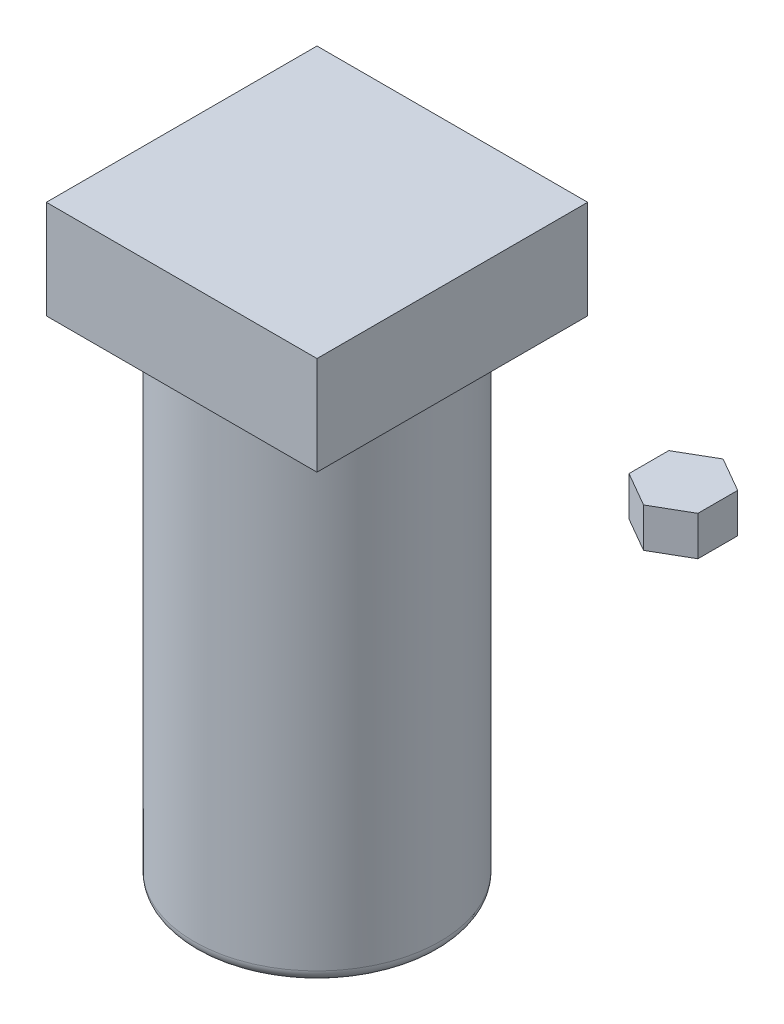
ISO-10303-21;
HEADER;
FILE_DESCRIPTION(('STEP AP214'),'2;1');
FILE_NAME('part.step','',(''),(''),'','','');
FILE_SCHEMA(('AUTOMOTIVE_DESIGN { 1 0 10303 214 1 1 1 1 }'));
ENDSEC;
DATA;
#1=APPLICATION_CONTEXT('core data for automotive mechanical design processes');
#2=APPLICATION_PROTOCOL_DEFINITION('international standard','automotive_design',2000,#1);
#3=PRODUCT_CONTEXT('',#1,'mechanical');
#4=PRODUCT('Part','Part','',(#3));
#5=PRODUCT_RELATED_PRODUCT_CATEGORY('part','',(#4));
#6=PRODUCT_DEFINITION_FORMATION('','',#4);
#7=PRODUCT_DEFINITION_CONTEXT('part definition',#1,'design');
#8=PRODUCT_DEFINITION('design','',#6,#7);
#9=PRODUCT_DEFINITION_SHAPE('','',#8);
#10=(LENGTH_UNIT() NAMED_UNIT(*) SI_UNIT(.MILLI.,.METRE.));
#11=(NAMED_UNIT(*) PLANE_ANGLE_UNIT() SI_UNIT($,.RADIAN.));
#12=(NAMED_UNIT(*) SI_UNIT($,.STERADIAN.) SOLID_ANGLE_UNIT());
#13=UNCERTAINTY_MEASURE_WITH_UNIT(LENGTH_MEASURE(1.E-05),#10,'distance_accuracy_value','');
#14=(GEOMETRIC_REPRESENTATION_CONTEXT(3) GLOBAL_UNCERTAINTY_ASSIGNED_CONTEXT((#13)) GLOBAL_UNIT_ASSIGNED_CONTEXT((#10,
#11,#12)) REPRESENTATION_CONTEXT('',''));
#15=CARTESIAN_POINT('',(0.,0.,0.));
#16=DIRECTION('',(0.,0.,1.));
#17=DIRECTION('',(1.,0.,0.));
#18=AXIS2_PLACEMENT_3D('',#15,#16,#17);
#19=CARTESIAN_POINT('',(42.8260773427026,5.08,2.56632194654789));
#20=DIRECTION('',(0.499999999999999,0.,-0.866025403784439));
#21=DIRECTION('',(-0.866025403784439,0.,-0.499999999999999));
#22=AXIS2_PLACEMENT_3D('',#19,#20,#21);
#23=PLANE('',#22);
#24=DIRECTION('',(0.866025403784439,0.,0.499999999999999));
#25=VECTOR('',#24,1.);
#26=CARTESIAN_POINT('',(42.8260773427026,0.,2.56632194654789));
#27=LINE('',#26,#25);
#28=CARTESIAN_POINT('',(42.8260773427026,0.,2.56632194654789));
#29=VERTEX_POINT('',#28);
#30=CARTESIAN_POINT('',(47.2710773427026,0.,5.13264389309577));
#31=VERTEX_POINT('',#30);
#32=EDGE_CURVE('E131',#29,#31,#27,.T.);
#33=ORIENTED_EDGE('',*,*,#32,.T.);
#34=DIRECTION('',(0.,-1.,0.));
#35=VECTOR('',#34,1.);
#36=CARTESIAN_POINT('',(47.2710773427026,5.08,5.13264389309577));
#37=LINE('',#36,#35);
#38=CARTESIAN_POINT('',(47.2710773427026,5.08,5.13264389309577));
#39=VERTEX_POINT('',#38);
#40=EDGE_CURVE('E12',#39,#31,#37,.T.);
#41=ORIENTED_EDGE('',*,*,#40,.F.);
#42=DIRECTION('',(0.866025403784439,0.,0.499999999999999));
#43=VECTOR('',#42,1.);
#44=CARTESIAN_POINT('',(42.8260773427026,5.08,2.56632194654789));
#45=LINE('',#44,#43);
#46=CARTESIAN_POINT('',(42.8260773427026,5.08,2.56632194654789));
#47=VERTEX_POINT('',#46);
#48=EDGE_CURVE('E141',#47,#39,#45,.T.);
#49=ORIENTED_EDGE('',*,*,#48,.F.);
#50=DIRECTION('',(0.,-1.,0.));
#51=VECTOR('',#50,1.);
#52=CARTESIAN_POINT('',(42.8260773427026,5.08,2.56632194654789));
#53=LINE('',#52,#51);
#54=EDGE_CURVE('E127',#47,#29,#53,.T.);
#55=ORIENTED_EDGE('',*,*,#54,.T.);
#56=EDGE_LOOP('',(#33,#41,#49,#55));
#57=FACE_BOUND('',#56,.T.);
#58=ADVANCED_FACE('F47',(#57),#23,.F.);
#59=CARTESIAN_POINT('',(47.2710773427026,5.08,5.13264389309577));
#60=DIRECTION('',(-0.500000000000001,0.,-0.866025403784438));
#61=DIRECTION('',(-0.866025403784438,0.,0.500000000000001));
#62=AXIS2_PLACEMENT_3D('',#59,#60,#61);
#63=PLANE('',#62);
#64=DIRECTION('',(0.866025403784438,0.,-0.500000000000001));
#65=VECTOR('',#64,1.);
#66=CARTESIAN_POINT('',(47.2710773427026,0.,5.13264389309577));
#67=LINE('',#66,#65);
#68=CARTESIAN_POINT('',(51.7160773427026,0.,2.56632194654789));
#69=VERTEX_POINT('',#68);
#70=EDGE_CURVE('E134',#31,#69,#67,.T.);
#71=ORIENTED_EDGE('',*,*,#70,.T.);
#72=DIRECTION('',(0.,-1.,0.));
#73=VECTOR('',#72,1.);
#74=CARTESIAN_POINT('',(51.7160773427026,5.08,2.56632194654789));
#75=LINE('',#74,#73);
#76=CARTESIAN_POINT('',(51.7160773427026,5.08,2.56632194654789));
#77=VERTEX_POINT('',#76);
#78=EDGE_CURVE('E55',#77,#69,#75,.T.);
#79=ORIENTED_EDGE('',*,*,#78,.F.);
#80=DIRECTION('',(0.866025403784438,0.,-0.500000000000001));
#81=VECTOR('',#80,1.);
#82=CARTESIAN_POINT('',(47.2710773427026,5.08,5.13264389309577));
#83=LINE('',#82,#81);
#84=EDGE_CURVE('E100',#39,#77,#83,.T.);
#85=ORIENTED_EDGE('',*,*,#84,.F.);
#86=ORIENTED_EDGE('',*,*,#40,.T.);
#87=EDGE_LOOP('',(#71,#79,#85,#86));
#88=FACE_BOUND('',#87,.T.);
#89=ADVANCED_FACE('F165',(#88),#63,.F.);
#90=CARTESIAN_POINT('',(51.7160773427026,5.08,2.56632194654789));
#91=DIRECTION('',(-1.,0.,0.));
#92=DIRECTION('',(0.,0.,1.));
#93=AXIS2_PLACEMENT_3D('',#90,#91,#92);
#94=PLANE('',#93);
#95=DIRECTION('',(0.,0.,-1.));
#96=VECTOR('',#95,1.);
#97=CARTESIAN_POINT('',(51.7160773427026,0.,2.56632194654789));
#98=LINE('',#97,#96);
#99=CARTESIAN_POINT('',(51.7160773427026,0.,-2.56632194654789));
#100=VERTEX_POINT('',#99);
#101=EDGE_CURVE('E136',#69,#100,#98,.T.);
#102=ORIENTED_EDGE('',*,*,#101,.T.);
#103=DIRECTION('',(0.,-1.,0.));
#104=VECTOR('',#103,1.);
#105=CARTESIAN_POINT('',(51.7160773427026,5.08,-2.56632194654789));
#106=LINE('',#105,#104);
#107=CARTESIAN_POINT('',(51.7160773427026,5.08,-2.56632194654789));
#108=VERTEX_POINT('',#107);
#109=EDGE_CURVE('E122',#108,#100,#106,.T.);
#110=ORIENTED_EDGE('',*,*,#109,.F.);
#111=DIRECTION('',(0.,0.,-1.));
#112=VECTOR('',#111,1.);
#113=CARTESIAN_POINT('',(51.7160773427026,5.08,2.56632194654789));
#114=LINE('',#113,#112);
#115=EDGE_CURVE('E113',#77,#108,#114,.T.);
#116=ORIENTED_EDGE('',*,*,#115,.F.);
#117=ORIENTED_EDGE('',*,*,#78,.T.);
#118=EDGE_LOOP('',(#102,#110,#116,#117));
#119=FACE_BOUND('',#118,.T.);
#120=ADVANCED_FACE('F147',(#119),#94,.F.);
#121=CARTESIAN_POINT('',(51.7160773427026,5.08,-2.56632194654789));
#122=DIRECTION('',(-0.5,0.,0.866025403784439));
#123=DIRECTION('',(0.866025403784439,0.,0.5));
#124=AXIS2_PLACEMENT_3D('',#121,#122,#123);
#125=PLANE('',#124);
#126=DIRECTION('',(-0.866025403784439,0.,-0.5));
#127=VECTOR('',#126,1.);
#128=CARTESIAN_POINT('',(51.7160773427026,0.,-2.56632194654789));
#129=LINE('',#128,#127);
#130=CARTESIAN_POINT('',(47.2710773427026,0.,-5.13264389309578));
#131=VERTEX_POINT('',#130);
#132=EDGE_CURVE('E121',#100,#131,#129,.T.);
#133=ORIENTED_EDGE('',*,*,#132,.T.);
#134=DIRECTION('',(0.,-1.,0.));
#135=VECTOR('',#134,1.);
#136=CARTESIAN_POINT('',(47.2710773427026,5.08,-5.13264389309578));
#137=LINE('',#136,#135);
#138=CARTESIAN_POINT('',(47.2710773427026,5.08,-5.13264389309578));
#139=VERTEX_POINT('',#138);
#140=EDGE_CURVE('E118',#139,#131,#137,.T.);
#141=ORIENTED_EDGE('',*,*,#140,.F.);
#142=DIRECTION('',(-0.866025403784439,0.,-0.5));
#143=VECTOR('',#142,1.);
#144=CARTESIAN_POINT('',(51.7160773427026,5.08,-2.56632194654789));
#145=LINE('',#144,#143);
#146=EDGE_CURVE('E107',#108,#139,#145,.T.);
#147=ORIENTED_EDGE('',*,*,#146,.F.);
#148=ORIENTED_EDGE('',*,*,#109,.T.);
#149=EDGE_LOOP('',(#133,#141,#147,#148));
#150=FACE_BOUND('',#149,.T.);
#151=ADVANCED_FACE('F119',(#150),#125,.F.);
#152=CARTESIAN_POINT('',(47.2710773427026,5.08,-5.13264389309578));
#153=DIRECTION('',(0.500000000000001,0.,0.866025403784438));
#154=DIRECTION('',(0.866025403784438,0.,-0.500000000000001));
#155=AXIS2_PLACEMENT_3D('',#152,#153,#154);
#156=PLANE('',#155);
#157=DIRECTION('',(-0.866025403784438,0.,0.500000000000001));
#158=VECTOR('',#157,1.);
#159=CARTESIAN_POINT('',(47.2710773427026,0.,-5.13264389309578));
#160=LINE('',#159,#158);
#161=CARTESIAN_POINT('',(42.8260773427026,0.,-2.56632194654789));
#162=VERTEX_POINT('',#161);
#163=EDGE_CURVE('E86',#131,#162,#160,.T.);
#164=ORIENTED_EDGE('',*,*,#163,.T.);
#165=DIRECTION('',(0.,-1.,0.));
#166=VECTOR('',#165,1.);
#167=CARTESIAN_POINT('',(42.8260773427026,5.08,-2.56632194654789));
#168=LINE('',#167,#166);
#169=CARTESIAN_POINT('',(42.8260773427026,5.08,-2.56632194654789));
#170=VERTEX_POINT('',#169);
#171=EDGE_CURVE('E123',#170,#162,#168,.T.);
#172=ORIENTED_EDGE('',*,*,#171,.F.);
#173=DIRECTION('',(-0.866025403784438,0.,0.500000000000001));
#174=VECTOR('',#173,1.);
#175=CARTESIAN_POINT('',(47.2710773427026,5.08,-5.13264389309578));
#176=LINE('',#175,#174);
#177=EDGE_CURVE('E111',#139,#170,#176,.T.);
#178=ORIENTED_EDGE('',*,*,#177,.F.);
#179=ORIENTED_EDGE('',*,*,#140,.T.);
#180=EDGE_LOOP('',(#164,#172,#178,#179));
#181=FACE_BOUND('',#180,.T.);
#182=ADVANCED_FACE('F125',(#181),#156,.F.);
#183=CARTESIAN_POINT('',(42.8260773427026,5.08,-2.56632194654789));
#184=DIRECTION('',(1.,0.,0.));
#185=DIRECTION('',(0.,0.,-1.));
#186=AXIS2_PLACEMENT_3D('',#183,#184,#185);
#187=PLANE('',#186);
#188=DIRECTION('',(0.,0.,1.));
#189=VECTOR('',#188,1.);
#190=CARTESIAN_POINT('',(42.8260773427026,0.,-2.56632194654789));
#191=LINE('',#190,#189);
#192=EDGE_CURVE('E92',#162,#29,#191,.T.);
#193=ORIENTED_EDGE('',*,*,#192,.T.);
#194=ORIENTED_EDGE('',*,*,#54,.F.);
#195=DIRECTION('',(0.,0.,1.));
#196=VECTOR('',#195,1.);
#197=CARTESIAN_POINT('',(42.8260773427026,5.08,-2.56632194654789));
#198=LINE('',#197,#196);
#199=EDGE_CURVE('E63',#170,#47,#198,.T.);
#200=ORIENTED_EDGE('',*,*,#199,.F.);
#201=ORIENTED_EDGE('',*,*,#171,.T.);
#202=EDGE_LOOP('',(#193,#194,#200,#201));
#203=FACE_BOUND('',#202,.T.);
#204=ADVANCED_FACE('F154',(#203),#187,.F.);
#205=CARTESIAN_POINT('',(0.,5.08,0.));
#206=DIRECTION('',(0.,1.,0.));
#207=DIRECTION('',(0.,0.,1.));
#208=AXIS2_PLACEMENT_3D('',#205,#206,#207);
#209=PLANE('',#208);
#210=ORIENTED_EDGE('',*,*,#48,.T.);
#211=ORIENTED_EDGE('',*,*,#84,.T.);
#212=ORIENTED_EDGE('',*,*,#115,.T.);
#213=ORIENTED_EDGE('',*,*,#146,.T.);
#214=ORIENTED_EDGE('',*,*,#177,.T.);
#215=ORIENTED_EDGE('',*,*,#199,.T.);
#216=EDGE_LOOP('',(#210,#211,#212,#213,#214,#215));
#217=FACE_BOUND('',#216,.T.);
#218=ADVANCED_FACE('F109',(#217),#209,.T.);
#219=CARTESIAN_POINT('',(0.,0.,0.));
#220=DIRECTION('',(0.,1.,0.));
#221=DIRECTION('',(0.,0.,1.));
#222=AXIS2_PLACEMENT_3D('',#219,#220,#221);
#223=PLANE('',#222);
#224=ORIENTED_EDGE('',*,*,#32,.F.);
#225=ORIENTED_EDGE('',*,*,#192,.F.);
#226=ORIENTED_EDGE('',*,*,#163,.F.);
#227=ORIENTED_EDGE('',*,*,#132,.F.);
#228=ORIENTED_EDGE('',*,*,#101,.F.);
#229=ORIENTED_EDGE('',*,*,#70,.F.);
#230=EDGE_LOOP('',(#224,#225,#226,#227,#228,#229));
#231=FACE_BOUND('',#230,.T.);
#232=ADVANCED_FACE('F150',(#231),#223,.F.);
#233=CLOSED_SHELL('',(#58,#89,#120,#151,#182,#204,#218,#232));
#234=MANIFOLD_SOLID_BREP('B2',#233);
#235=CARTESIAN_POINT('',(17.4625,12.7,-17.4625));
#236=DIRECTION('',(-1.,0.,0.));
#237=DIRECTION('',(0.,0.,1.));
#238=AXIS2_PLACEMENT_3D('',#235,#236,#237);
#239=PLANE('',#238);
#240=DIRECTION('',(0.,0.,-1.));
#241=VECTOR('',#240,1.);
#242=CARTESIAN_POINT('',(17.4625,0.,-17.4625));
#243=LINE('',#242,#241);
#244=CARTESIAN_POINT('',(17.4625,0.,17.4625));
#245=VERTEX_POINT('',#244);
#246=CARTESIAN_POINT('',(17.4625,0.,-17.4625));
#247=VERTEX_POINT('',#246);
#248=EDGE_CURVE('E307',#245,#247,#243,.T.);
#249=ORIENTED_EDGE('',*,*,#248,.T.);
#250=DIRECTION('',(0.,-1.,0.));
#251=VECTOR('',#250,1.);
#252=CARTESIAN_POINT('',(17.4625,12.7,-17.4625));
#253=LINE('',#252,#251);
#254=CARTESIAN_POINT('',(17.4625,12.7,-17.4625));
#255=VERTEX_POINT('',#254);
#256=EDGE_CURVE('E298',#255,#247,#253,.T.);
#257=ORIENTED_EDGE('',*,*,#256,.F.);
#258=DIRECTION('',(0.,0.,-1.));
#259=VECTOR('',#258,1.);
#260=CARTESIAN_POINT('',(17.4625,12.7,-17.4625));
#261=LINE('',#260,#259);
#262=CARTESIAN_POINT('',(17.4625,12.7,17.4625));
#263=VERTEX_POINT('',#262);
#264=EDGE_CURVE('E292',#263,#255,#261,.T.);
#265=ORIENTED_EDGE('',*,*,#264,.F.);
#266=DIRECTION('',(0.,-1.,0.));
#267=VECTOR('',#266,1.);
#268=CARTESIAN_POINT('',(17.4625,12.7,17.4625));
#269=LINE('',#268,#267);
#270=EDGE_CURVE('E303',#263,#245,#269,.T.);
#271=ORIENTED_EDGE('',*,*,#270,.T.);
#272=EDGE_LOOP('',(#249,#257,#265,#271));
#273=FACE_BOUND('',#272,.T.);
#274=ADVANCED_FACE('F239',(#273),#239,.F.);
#275=CARTESIAN_POINT('',(-17.4625,12.7,-17.4625));
#276=DIRECTION('',(0.,0.,1.));
#277=DIRECTION('',(1.,0.,0.));
#278=AXIS2_PLACEMENT_3D('',#275,#276,#277);
#279=PLANE('',#278);
#280=DIRECTION('',(-1.,0.,0.));
#281=VECTOR('',#280,1.);
#282=CARTESIAN_POINT('',(-17.4625,0.,-17.4625));
#283=LINE('',#282,#281);
#284=CARTESIAN_POINT('',(-17.4625,0.,-17.4625));
#285=VERTEX_POINT('',#284);
#286=EDGE_CURVE('E297',#247,#285,#283,.T.);
#287=ORIENTED_EDGE('',*,*,#286,.T.);
#288=DIRECTION('',(0.,-1.,0.));
#289=VECTOR('',#288,1.);
#290=CARTESIAN_POINT('',(-17.4625,12.7,-17.4625));
#291=LINE('',#290,#289);
#292=CARTESIAN_POINT('',(-17.4625,12.7,-17.4625));
#293=VERTEX_POINT('',#292);
#294=EDGE_CURVE('E295',#293,#285,#291,.T.);
#295=ORIENTED_EDGE('',*,*,#294,.F.);
#296=DIRECTION('',(-1.,0.,0.));
#297=VECTOR('',#296,1.);
#298=CARTESIAN_POINT('',(-17.4625,12.7,-17.4625));
#299=LINE('',#298,#297);
#300=EDGE_CURVE('E287',#255,#293,#299,.T.);
#301=ORIENTED_EDGE('',*,*,#300,.F.);
#302=ORIENTED_EDGE('',*,*,#256,.T.);
#303=EDGE_LOOP('',(#287,#295,#301,#302));
#304=FACE_BOUND('',#303,.T.);
#305=ADVANCED_FACE('F296',(#304),#279,.F.);
#306=CARTESIAN_POINT('',(-17.4625,12.7,-17.4625));
#307=DIRECTION('',(1.,0.,0.));
#308=DIRECTION('',(0.,0.,-1.));
#309=AXIS2_PLACEMENT_3D('',#306,#307,#308);
#310=PLANE('',#309);
#311=DIRECTION('',(0.,0.,1.));
#312=VECTOR('',#311,1.);
#313=CARTESIAN_POINT('',(-17.4625,0.,-17.4625));
#314=LINE('',#313,#312);
#315=CARTESIAN_POINT('',(-17.4625,0.,17.4625));
#316=VERTEX_POINT('',#315);
#317=EDGE_CURVE('E273',#285,#316,#314,.T.);
#318=ORIENTED_EDGE('',*,*,#317,.T.);
#319=DIRECTION('',(0.,-1.,0.));
#320=VECTOR('',#319,1.);
#321=CARTESIAN_POINT('',(-17.4625,12.7,17.4625));
#322=LINE('',#321,#320);
#323=CARTESIAN_POINT('',(-17.4625,12.7,17.4625));
#324=VERTEX_POINT('',#323);
#325=EDGE_CURVE('E299',#324,#316,#322,.T.);
#326=ORIENTED_EDGE('',*,*,#325,.F.);
#327=DIRECTION('',(0.,0.,1.));
#328=VECTOR('',#327,1.);
#329=CARTESIAN_POINT('',(-17.4625,12.7,-17.4625));
#330=LINE('',#329,#328);
#331=EDGE_CURVE('E290',#293,#324,#330,.T.);
#332=ORIENTED_EDGE('',*,*,#331,.F.);
#333=ORIENTED_EDGE('',*,*,#294,.T.);
#334=EDGE_LOOP('',(#318,#326,#332,#333));
#335=FACE_BOUND('',#334,.T.);
#336=ADVANCED_FACE('F301',(#335),#310,.F.);
#337=CARTESIAN_POINT('',(-17.4625,12.7,17.4625));
#338=DIRECTION('',(0.,0.,-1.));
#339=DIRECTION('',(-1.,0.,0.));
#340=AXIS2_PLACEMENT_3D('',#337,#338,#339);
#341=PLANE('',#340);
#342=DIRECTION('',(1.,0.,0.));
#343=VECTOR('',#342,1.);
#344=CARTESIAN_POINT('',(-17.4625,0.,17.4625));
#345=LINE('',#344,#343);
#346=EDGE_CURVE('E279',#316,#245,#345,.T.);
#347=ORIENTED_EDGE('',*,*,#346,.T.);
#348=ORIENTED_EDGE('',*,*,#270,.F.);
#349=DIRECTION('',(1.,0.,0.));
#350=VECTOR('',#349,1.);
#351=CARTESIAN_POINT('',(-17.4625,12.7,17.4625));
#352=LINE('',#351,#350);
#353=EDGE_CURVE('E256',#324,#263,#352,.T.);
#354=ORIENTED_EDGE('',*,*,#353,.F.);
#355=ORIENTED_EDGE('',*,*,#325,.T.);
#356=EDGE_LOOP('',(#347,#348,#354,#355));
#357=FACE_BOUND('',#356,.T.);
#358=ADVANCED_FACE('F345',(#357),#341,.F.);
#359=CARTESIAN_POINT('',(0.,12.7,0.));
#360=DIRECTION('',(0.,1.,0.));
#361=DIRECTION('',(0.,0.,1.));
#362=AXIS2_PLACEMENT_3D('',#359,#360,#361);
#363=PLANE('',#362);
#364=ORIENTED_EDGE('',*,*,#264,.T.);
#365=ORIENTED_EDGE('',*,*,#300,.T.);
#366=ORIENTED_EDGE('',*,*,#331,.T.);
#367=ORIENTED_EDGE('',*,*,#353,.T.);
#368=EDGE_LOOP('',(#364,#365,#366,#367));
#369=FACE_BOUND('',#368,.T.);
#370=ADVANCED_FACE('F288',(#369),#363,.T.);
#371=CARTESIAN_POINT('',(0.,0.,0.));
#372=DIRECTION('',(0.,1.,0.));
#373=DIRECTION('',(0.,0.,1.));
#374=AXIS2_PLACEMENT_3D('',#371,#372,#373);
#375=PLANE('',#374);
#376=CARTESIAN_POINT('',(0.,0.,0.));
#377=DIRECTION('',(0.,1.,0.));
#378=DIRECTION('',(0.,0.,1.));
#379=AXIS2_PLACEMENT_3D('',#376,#377,#378);
#380=CIRCLE('',#379,15.875);
#381=CARTESIAN_POINT('',(0.,0.,15.875));
#382=VERTEX_POINT('',#381);
#383=EDGE_CURVE('E317',#382,#382,#380,.F.);
#384=ORIENTED_EDGE('',*,*,#383,.F.);
#385=EDGE_LOOP('',(#384));
#386=FACE_BOUND('',#385,.T.);
#387=ORIENTED_EDGE('',*,*,#248,.F.);
#388=ORIENTED_EDGE('',*,*,#346,.F.);
#389=ORIENTED_EDGE('',*,*,#317,.F.);
#390=ORIENTED_EDGE('',*,*,#286,.F.);
#391=EDGE_LOOP('',(#387,#388,#389,#390));
#392=FACE_BOUND('',#391,.T.);
#393=ADVANCED_FACE('F334',(#386,#392),#375,.F.);
#394=CARTESIAN_POINT('',(0.,-63.5,0.));
#395=DIRECTION('',(0.,-1.,0.));
#396=DIRECTION('',(0.,0.,-1.));
#397=AXIS2_PLACEMENT_3D('',#394,#395,#396);
#398=PLANE('',#397);
#399=CARTESIAN_POINT('',(0.,-63.5,0.));
#400=DIRECTION('',(0.,-1.,0.));
#401=DIRECTION('',(0.,0.,-1.));
#402=AXIS2_PLACEMENT_3D('',#399,#400,#401);
#403=CIRCLE('',#402,14.351);
#404=CARTESIAN_POINT('',(0.,-63.5,-14.351));
#405=VERTEX_POINT('',#404);
#406=EDGE_CURVE('E248',#405,#405,#403,.T.);
#407=ORIENTED_EDGE('',*,*,#406,.T.);
#408=EDGE_LOOP('',(#407));
#409=FACE_BOUND('',#408,.T.);
#410=CARTESIAN_POINT('',(0.,-63.5,0.));
#411=DIRECTION('',(0.,-1.,0.));
#412=DIRECTION('',(0.,0.,-1.));
#413=AXIS2_PLACEMENT_3D('',#410,#411,#412);
#414=CIRCLE('',#413,12.7);
#415=CARTESIAN_POINT('',(0.,-63.5,-12.7));
#416=VERTEX_POINT('',#415);
#417=EDGE_CURVE('E310',#416,#416,#414,.T.);
#418=ORIENTED_EDGE('',*,*,#417,.F.);
#419=EDGE_LOOP('',(#418));
#420=FACE_BOUND('',#419,.T.);
#421=ADVANCED_FACE('F322',(#409,#420),#398,.T.);
#422=CARTESIAN_POINT('',(0.,-63.5,0.));
#423=DIRECTION('',(0.,1.,0.));
#424=DIRECTION('',(0.,0.,1.));
#425=AXIS2_PLACEMENT_3D('',#422,#423,#424);
#426=CYLINDRICAL_SURFACE('',#425,15.875);
#427=CARTESIAN_POINT('',(0.,-61.976,0.));
#428=DIRECTION('',(0.,-1.,0.));
#429=DIRECTION('',(0.,0.,-1.));
#430=AXIS2_PLACEMENT_3D('',#427,#428,#429);
#431=CIRCLE('',#430,15.875);
#432=CARTESIAN_POINT('',(0.,-61.976,-15.875));
#433=VERTEX_POINT('',#432);
#434=EDGE_CURVE('E45',#433,#433,#431,.F.);
#435=ORIENTED_EDGE('',*,*,#434,.T.);
#436=EDGE_LOOP('',(#435));
#437=FACE_BOUND('',#436,.T.);
#438=ORIENTED_EDGE('',*,*,#383,.T.);
#439=EDGE_LOOP('',(#438));
#440=FACE_BOUND('',#439,.T.);
#441=ADVANCED_FACE('F352',(#437,#440),#426,.T.);
#442=CARTESIAN_POINT('',(0.,-63.5,0.));
#443=DIRECTION('',(0.,1.,0.));
#444=DIRECTION('',(0.,0.,1.));
#445=AXIS2_PLACEMENT_3D('',#442,#443,#444);
#446=CYLINDRICAL_SURFACE('',#445,12.7);
#447=ORIENTED_EDGE('',*,*,#417,.T.);
#448=EDGE_LOOP('',(#447));
#449=FACE_BOUND('',#448,.T.);
#450=CARTESIAN_POINT('',(0.,0.,0.));
#451=DIRECTION('',(0.,-1.,0.));
#452=DIRECTION('',(0.,0.,-1.));
#453=AXIS2_PLACEMENT_3D('',#450,#451,#452);
#454=CIRCLE('',#453,12.7);
#455=CARTESIAN_POINT('',(0.,0.,-12.7));
#456=VERTEX_POINT('',#455);
#457=EDGE_CURVE('E367',#456,#456,#454,.T.);
#458=ORIENTED_EDGE('',*,*,#457,.F.);
#459=EDGE_LOOP('',(#458));
#460=FACE_BOUND('',#459,.T.);
#461=ADVANCED_FACE('F331',(#449,#460),#446,.F.);
#462=ORIENTED_EDGE('',*,*,#457,.T.);
#463=EDGE_LOOP('',(#462));
#464=FACE_BOUND('',#463,.T.);
#465=ADVANCED_FACE('F326',(#464),#375,.F.);
#466=CARTESIAN_POINT('',(0.,-61.976,0.));
#467=DIRECTION('',(0.,-1.,0.));
#468=DIRECTION('',(0.,0.,-1.));
#469=AXIS2_PLACEMENT_3D('',#466,#467,#468);
#470=TOROIDAL_SURFACE('',#469,14.351,1.524);
#471=ORIENTED_EDGE('',*,*,#434,.F.);
#472=EDGE_LOOP('',(#471));
#473=FACE_BOUND('',#472,.T.);
#474=ORIENTED_EDGE('',*,*,#406,.F.);
#475=EDGE_LOOP('',(#474));
#476=FACE_BOUND('',#475,.T.);
#477=ADVANCED_FACE('F241',(#473,#476),#470,.T.);
#478=CLOSED_SHELL('',(#274,#305,#336,#358,#370,#393,#421,#441,#461,#465,#477));
#479=MANIFOLD_SOLID_BREP('B6',#478);
#480=ADVANCED_BREP_SHAPE_REPRESENTATION('',(#18,#234,#479),#14);
#481=SHAPE_DEFINITION_REPRESENTATION(#9,#480);
ENDSEC;
END-ISO-10303-21;
